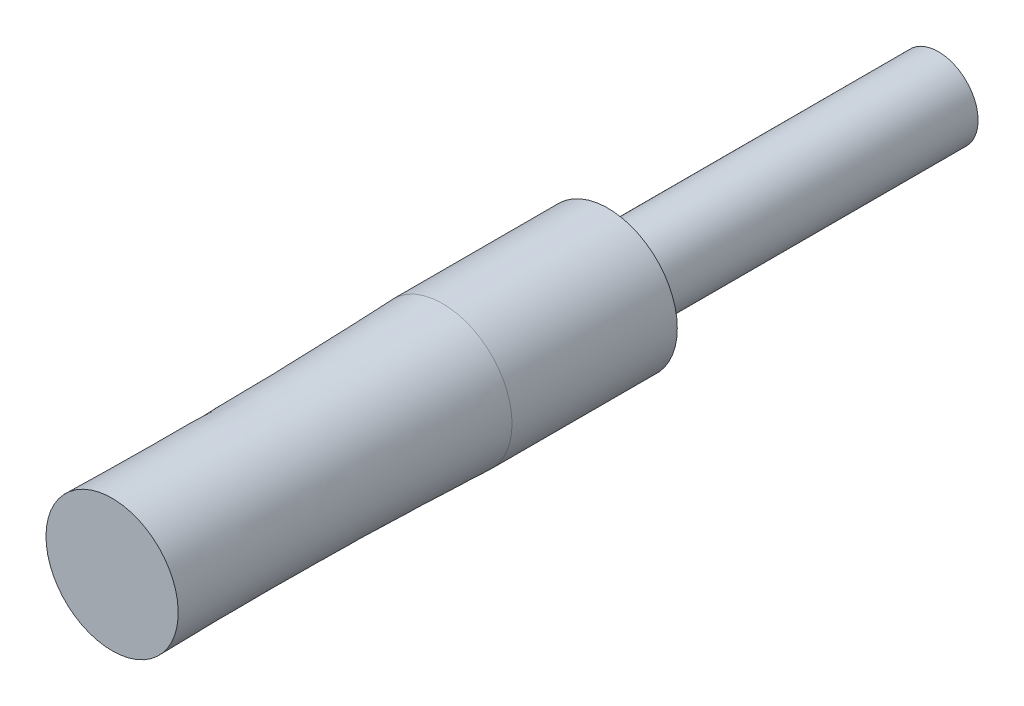
ISO-10303-21;
HEADER;
FILE_DESCRIPTION(('STEP AP214'),'2;1');
FILE_NAME('part.step','',(''),(''),'','','');
FILE_SCHEMA(('AUTOMOTIVE_DESIGN { 1 0 10303 214 1 1 1 1 }'));
ENDSEC;
DATA;
#1=APPLICATION_CONTEXT('core data for automotive mechanical design processes');
#2=APPLICATION_PROTOCOL_DEFINITION('international standard','automotive_design',2000,#1);
#3=PRODUCT_CONTEXT('',#1,'mechanical');
#4=PRODUCT('Part','Part','',(#3));
#5=PRODUCT_RELATED_PRODUCT_CATEGORY('part','',(#4));
#6=PRODUCT_DEFINITION_FORMATION('','',#4);
#7=PRODUCT_DEFINITION_CONTEXT('part definition',#1,'design');
#8=PRODUCT_DEFINITION('design','',#6,#7);
#9=PRODUCT_DEFINITION_SHAPE('','',#8);
#10=(LENGTH_UNIT() NAMED_UNIT(*) SI_UNIT(.MILLI.,.METRE.));
#11=(NAMED_UNIT(*) PLANE_ANGLE_UNIT() SI_UNIT($,.RADIAN.));
#12=(NAMED_UNIT(*) SI_UNIT($,.STERADIAN.) SOLID_ANGLE_UNIT());
#13=UNCERTAINTY_MEASURE_WITH_UNIT(LENGTH_MEASURE(1.E-05),#10,'distance_accuracy_value','');
#14=(GEOMETRIC_REPRESENTATION_CONTEXT(3) GLOBAL_UNCERTAINTY_ASSIGNED_CONTEXT((#13)) GLOBAL_UNIT_ASSIGNED_CONTEXT((#10,
#11,#12)) REPRESENTATION_CONTEXT('',''));
#15=CARTESIAN_POINT('',(0.,0.,0.));
#16=DIRECTION('',(0.,0.,1.));
#17=DIRECTION('',(1.,0.,0.));
#18=AXIS2_PLACEMENT_3D('',#15,#16,#17);
#19=CARTESIAN_POINT('',(0.,0.,10.));
#20=DIRECTION('',(0.,0.,-1.));
#21=DIRECTION('',(-1.,0.,0.));
#22=AXIS2_PLACEMENT_3D('',#19,#20,#21);
#23=CYLINDRICAL_SURFACE('',#22,4.2);
#24=CARTESIAN_POINT('',(0.,0.,10.));
#25=DIRECTION('',(0.,0.,-1.));
#26=DIRECTION('',(-1.,0.,0.));
#27=AXIS2_PLACEMENT_3D('',#24,#25,#26);
#28=CIRCLE('',#27,4.2);
#29=CARTESIAN_POINT('',(-0.11082252498562,-4.19853764636639,10.));
#30=VERTEX_POINT('',#29);
#31=EDGE_CURVE('E42',#30,#30,#28,.F.);
#32=ORIENTED_EDGE('',*,*,#31,.F.);
#33=EDGE_LOOP('',(#32));
#34=FACE_BOUND('',#33,.T.);
#35=CARTESIAN_POINT('',(0.,0.,0.));
#36=DIRECTION('',(0.,0.,1.));
#37=DIRECTION('',(1.,0.,0.));
#38=AXIS2_PLACEMENT_3D('',#35,#36,#37);
#39=CIRCLE('',#38,4.2);
#40=CARTESIAN_POINT('',(4.2,0.,0.));
#41=VERTEX_POINT('',#40);
#42=EDGE_CURVE('E47',#41,#41,#39,.T.);
#43=ORIENTED_EDGE('',*,*,#42,.T.);
#44=EDGE_LOOP('',(#43));
#45=FACE_BOUND('',#44,.T.);
#46=ADVANCED_FACE('F35',(#34,#45),#23,.T.);
#47=CARTESIAN_POINT('',(0.,0.,0.));
#48=DIRECTION('',(0.,0.,1.));
#49=DIRECTION('',(1.,0.,0.));
#50=AXIS2_PLACEMENT_3D('',#47,#48,#49);
#51=PLANE('',#50);
#52=CARTESIAN_POINT('',(0.,0.,0.));
#53=DIRECTION('',(0.,0.,-1.));
#54=DIRECTION('',(-1.,0.,0.));
#55=AXIS2_PLACEMENT_3D('',#52,#53,#54);
#56=CIRCLE('',#55,2.4);
#57=CARTESIAN_POINT('',(-2.4,0.,0.));
#58=VERTEX_POINT('',#57);
#59=EDGE_CURVE('E11',#58,#58,#56,.T.);
#60=ORIENTED_EDGE('',*,*,#59,.F.);
#61=EDGE_LOOP('',(#60));
#62=FACE_BOUND('',#61,.T.);
#63=ORIENTED_EDGE('',*,*,#42,.F.);
#64=EDGE_LOOP('',(#63));
#65=FACE_BOUND('',#64,.T.);
#66=ADVANCED_FACE('F76',(#62,#65),#51,.F.);
#67=CARTESIAN_POINT('',(0.,0.,30.));
#68=DIRECTION('',(0.,0.,1.));
#69=DIRECTION('',(1.,0.,0.));
#70=AXIS2_PLACEMENT_3D('',#67,#68,#69);
#71=PLANE('',#70);
#72=CARTESIAN_POINT('',(0.,0.,30.));
#73=DIRECTION('',(0.,0.,1.));
#74=DIRECTION('',(1.,0.,0.));
#75=AXIS2_PLACEMENT_3D('',#72,#73,#74);
#76=CIRCLE('',#75,4.);
#77=CARTESIAN_POINT('',(1.94680537039833,-3.49427372279108,30.));
#78=VERTEX_POINT('',#77);
#79=EDGE_CURVE('E55',#78,#78,#76,.T.);
#80=ORIENTED_EDGE('',*,*,#79,.T.);
#81=EDGE_LOOP('',(#80));
#82=FACE_BOUND('',#81,.T.);
#83=ADVANCED_FACE('F73',(#82),#71,.T.);
#84=CARTESIAN_POINT('',(1.94680537039833,-3.49427372279108,30.));
#85=CARTESIAN_POINT('',(-0.11082252498562,-4.19853764636639,10.));
#86=CARTESIAN_POINT('',(-5.04174207518384,-7.38788446358773,30.));
#87=CARTESIAN_POINT('',(-8.5078978177184,-3.97689259639515,10.));
#88=CARTESIAN_POINT('',(-8.93535281598048,-0.399337018005571,30.));
#89=CARTESIAN_POINT('',(-8.28625276774716,4.42018269633763,10.));
#90=CARTESIAN_POINT('',(-1.94680537039833,3.49427372279108,30.));
#91=CARTESIAN_POINT('',(0.11082252498562,4.19853764636639,10.));
#92=CARTESIAN_POINT('',(5.04174207518384,7.38788446358774,30.));
#93=CARTESIAN_POINT('',(8.5078978177184,3.97689259639515,10.));
#94=CARTESIAN_POINT('',(8.93535281598049,0.399337018005566,30.));
#95=CARTESIAN_POINT('',(8.28625276774716,-4.42018269633764,10.));
#96=CARTESIAN_POINT('',(1.94680537039833,-3.49427372279108,30.));
#97=CARTESIAN_POINT('',(-0.11082252498562,-4.19853764636639,10.));
#98=(BOUNDED_SURFACE() B_SPLINE_SURFACE(3,1,((#84,#85),(#86,#87),(#88,#89),(#90,#91),(#92,#93),
(#94,#95),(#96,#97)),.UNSPECIFIED.,.T.,.F.,.F.) B_SPLINE_SURFACE_WITH_KNOTS((4,3,4),(2,2),(0.,
0.5,1.),(0.,1.),.UNSPECIFIED.) GEOMETRIC_REPRESENTATION_ITEM() RATIONAL_B_SPLINE_SURFACE(((1.,
1.),(0.333333333333333,0.333333333333333),(0.333333333333333,0.333333333333333),(1.,1.),
(0.333333333333333,0.333333333333333),(0.333333333333333,0.333333333333333),(1.,1.))) REPRESENTATION_ITEM('') SURFACE());
#99=CARTESIAN_POINT('',(1.94680537039833,-3.49427372279108,30.));
#100=CARTESIAN_POINT('',(1.92537174648808,-3.50160980532832,29.7916666666667));
#101=CARTESIAN_POINT('',(1.90393812257783,-3.50894588786557,29.5833333333333));
#102=CARTESIAN_POINT('',(1.86107087475733,-3.52361805294005,29.1666666666667));
#103=CARTESIAN_POINT('',(1.83963725084708,-3.53095413547729,28.9583333333333));
#104=CARTESIAN_POINT('',(1.79677000302658,-3.54562630055178,28.5416666666667));
#105=CARTESIAN_POINT('',(1.77533637911633,-3.55296238308902,28.3333333333333));
#106=CARTESIAN_POINT('',(1.73246913129583,-3.56763454816351,27.9166666666667));
#107=CARTESIAN_POINT('',(1.71103550738558,-3.57497063070075,27.7083333333333));
#108=CARTESIAN_POINT('',(1.66816825956508,-3.58964279577524,27.2916666666667));
#109=CARTESIAN_POINT('',(1.64673463565483,-3.59697887831248,27.0833333333333));
#110=CARTESIAN_POINT('',(1.60386738783433,-3.61165104338697,26.6666666666667));
#111=CARTESIAN_POINT('',(1.58243376392409,-3.61898712592421,26.4583333333333));
#112=CARTESIAN_POINT('',(1.53956651610359,-3.63365929099869,26.0416666666667));
#113=CARTESIAN_POINT('',(1.51813289219334,-3.64099537353594,25.8333333333333));
#114=CARTESIAN_POINT('',(1.47526564437284,-3.65566753861042,25.4166666666667));
#115=CARTESIAN_POINT('',(1.45383202046259,-3.66300362114767,25.2083333333333));
#116=CARTESIAN_POINT('',(1.41096477264209,-3.67767578622215,24.7916666666667));
#117=CARTESIAN_POINT('',(1.38953114873184,-3.68501186875939,24.5833333333333));
#118=CARTESIAN_POINT('',(1.34666390091134,-3.69968403383388,24.1666666666667));
#119=CARTESIAN_POINT('',(1.32523027700109,-3.70702011637112,23.9583333333333));
#120=CARTESIAN_POINT('',(1.28236302918059,-3.72169228144561,23.5416666666667));
#121=CARTESIAN_POINT('',(1.26092940527034,-3.72902836398285,23.3333333333333));
#122=CARTESIAN_POINT('',(1.21806215744984,-3.74370052905734,22.9166666666667));
#123=CARTESIAN_POINT('',(1.1966285335396,-3.75103661159458,22.7083333333333));
#124=CARTESIAN_POINT('',(1.1537612857191,-3.76570877666906,22.2916666666667));
#125=CARTESIAN_POINT('',(1.13232766180885,-3.77304485920631,22.0833333333333));
#126=CARTESIAN_POINT('',(1.08946041398835,-3.78771702428079,21.6666666666667));
#127=CARTESIAN_POINT('',(1.0680267900781,-3.79505310681804,21.4583333333333));
#128=CARTESIAN_POINT('',(1.0251595422576,-3.80972527189252,21.0416666666667));
#129=CARTESIAN_POINT('',(1.00372591834735,-3.81706135442976,20.8333333333333));
#130=CARTESIAN_POINT('',(0.960858670526852,-3.83173351950425,20.4166666666667));
#131=CARTESIAN_POINT('',(0.939425046616602,-3.83906960204149,20.2083333333333));
#132=CARTESIAN_POINT('',(0.896557798796103,-3.85374176711598,19.7916666666667));
#133=CARTESIAN_POINT('',(0.875124174885854,-3.86107784965322,19.5833333333333));
#134=CARTESIAN_POINT('',(0.832256927065355,-3.87575001472771,19.1666666666667));
#135=CARTESIAN_POINT('',(0.810823303155106,-3.88308609726495,18.9583333333333));
#136=CARTESIAN_POINT('',(0.767956055334607,-3.89775826233943,18.5416666666667));
#137=CARTESIAN_POINT('',(0.746522431424357,-3.90509434487668,18.3333333333333));
#138=CARTESIAN_POINT('',(0.703655183603858,-3.91976650995116,17.9166666666667));
#139=CARTESIAN_POINT('',(0.682221559693609,-3.92710259248841,17.7083333333333));
#140=CARTESIAN_POINT('',(0.63935431187311,-3.94177475756289,17.2916666666667));
#141=CARTESIAN_POINT('',(0.617920687962861,-3.94911084010013,17.0833333333333));
#142=CARTESIAN_POINT('',(0.575053440142362,-3.96378300517462,16.6666666666667));
#143=CARTESIAN_POINT('',(0.553619816232112,-3.97111908771186,16.4583333333333));
#144=CARTESIAN_POINT('',(0.510752568411613,-3.98579125278635,16.0416666666667));
#145=CARTESIAN_POINT('',(0.489318944501364,-3.99312733532359,15.8333333333333));
#146=CARTESIAN_POINT('',(0.446451696680865,-4.00779950039808,15.4166666666667));
#147=CARTESIAN_POINT('',(0.425018072770616,-4.01513558293532,15.2083333333333));
#148=CARTESIAN_POINT('',(0.382150824950117,-4.0298077480098,14.7916666666667));
#149=CARTESIAN_POINT('',(0.360717201039867,-4.03714383054705,14.5833333333333));
#150=CARTESIAN_POINT('',(0.317849953219368,-4.05181599562153,14.1666666666667));
#151=CARTESIAN_POINT('',(0.296416329309119,-4.05915207815878,13.9583333333333));
#152=CARTESIAN_POINT('',(0.25354908148862,-4.07382424323326,13.5416666666667));
#153=CARTESIAN_POINT('',(0.232115457578371,-4.0811603257705,13.3333333333333));
#154=CARTESIAN_POINT('',(0.189248209757872,-4.09583249084499,12.9166666666667));
#155=CARTESIAN_POINT('',(0.167814585847622,-4.10316857338223,12.7083333333333));
#156=CARTESIAN_POINT('',(0.124947338027124,-4.11784073845672,12.2916666666667));
#157=CARTESIAN_POINT('',(0.103513714116874,-4.12517682099396,12.0833333333333));
#158=CARTESIAN_POINT('',(0.0606464662963753,-4.13984898606845,11.6666666666667));
#159=CARTESIAN_POINT('',(0.0392128423861258,-4.14718506860569,11.4583333333333));
#160=CARTESIAN_POINT('',(-0.00365440543437302,-4.16185723368018,11.0416666666667));
#161=CARTESIAN_POINT('',(-0.0250880293446224,-4.16919331621742,10.8333333333333));
#162=CARTESIAN_POINT('',(-0.0679552771651213,-4.1838654812919,10.4166666666667));
#163=CARTESIAN_POINT('',(-0.0893889010753707,-4.19120156382915,10.2083333333333));
#164=CARTESIAN_POINT('',(-0.11082252498562,-4.19853764636639,10.));
#165=B_SPLINE_CURVE_WITH_KNOTS('',3,(#99,#100,#101,#102,#103,#104,#105,#106,#107,#108,#109,#110,
#111,#112,#113,#114,#115,#116,#117,#118,#119,#120,#121,#122,#123,#124,#125,#126,#127,#128,#129,
#130,#131,#132,#133,#134,#135,#136,#137,#138,#139,#140,#141,#142,#143,#144,#145,#146,#147,#148,
#149,#150,#151,#152,#153,#154,#155,#156,#157,#158,#159,#160,#161,#162,#163,#164),.UNSPECIFIED.,
.F.,.F.,(4,2,2,2,2,2,2,2,2,2,2,2,2,2,2,2,2,2,2,2,2,2,2,2,2,2,2,2,2,2,2,2,4),(0.,
0.628684312726406,1.25736862545281,1.88605293817922,2.51473725090562,3.14342156363203,
3.77210587635843,4.40079018908484,5.02947450181125,5.65815881453765,6.28684312726406,
6.91552743999046,7.54421175271687,8.17289606544328,8.80158037816968,9.43026469089609,
10.0589490036225,10.6876333163489,11.3163176290753,11.9450019418017,12.5736862545281,
13.2023705672545,13.8310548799809,14.4597391927073,15.0884235054337,15.7171078181601,
16.3457921308866,16.974476443613,17.6031607563394,18.2318450690658,18.8605293817922,
19.4892136945186,20.117898007245),.UNSPECIFIED.);
#166=EDGE_CURVE('BSEAM61',#78,#30,#165,.T.);
#167=ORIENTED_EDGE('',*,*,#79,.F.);
#168=ORIENTED_EDGE('',*,*,#31,.T.);
#169=ORIENTED_EDGE('',*,*,#166,.T.);
#170=ORIENTED_EDGE('',*,*,#166,.F.);
#171=EDGE_LOOP('',(#167,#169,#168,#170));
#172=FACE_BOUND('',#171,.T.);
#173=ADVANCED_FACE('F61',(#172),#98,.T.);
#174=CARTESIAN_POINT('',(0.,0.,-20.));
#175=DIRECTION('',(0.,0.,1.));
#176=DIRECTION('',(1.,0.,0.));
#177=AXIS2_PLACEMENT_3D('',#174,#175,#176);
#178=CYLINDRICAL_SURFACE('',#177,2.4);
#179=CARTESIAN_POINT('',(0.,0.,-20.));
#180=DIRECTION('',(0.,0.,-1.));
#181=DIRECTION('',(-1.,0.,0.));
#182=AXIS2_PLACEMENT_3D('',#179,#180,#181);
#183=CIRCLE('',#182,2.4);
#184=CARTESIAN_POINT('',(-2.4,0.,-20.));
#185=VERTEX_POINT('',#184);
#186=EDGE_CURVE('E50',#185,#185,#183,.T.);
#187=ORIENTED_EDGE('',*,*,#186,.F.);
#188=EDGE_LOOP('',(#187));
#189=FACE_BOUND('',#188,.T.);
#190=ORIENTED_EDGE('',*,*,#59,.T.);
#191=EDGE_LOOP('',(#190));
#192=FACE_BOUND('',#191,.T.);
#193=ADVANCED_FACE('F72',(#189,#192),#178,.T.);
#194=CARTESIAN_POINT('',(0.,0.,-20.));
#195=DIRECTION('',(0.,0.,-1.));
#196=DIRECTION('',(-1.,0.,0.));
#197=AXIS2_PLACEMENT_3D('',#194,#195,#196);
#198=PLANE('',#197);
#199=ORIENTED_EDGE('',*,*,#186,.T.);
#200=EDGE_LOOP('',(#199));
#201=FACE_BOUND('',#200,.T.);
#202=ADVANCED_FACE('F108',(#201),#198,.T.);
#203=CLOSED_SHELL('',(#46,#66,#83,#173,#193,#202));
#204=MANIFOLD_SOLID_BREP('B2',#203);
#205=ADVANCED_BREP_SHAPE_REPRESENTATION('',(#18,#204),#14);
#206=SHAPE_DEFINITION_REPRESENTATION(#9,#205);
ENDSEC;
END-ISO-10303-21;
